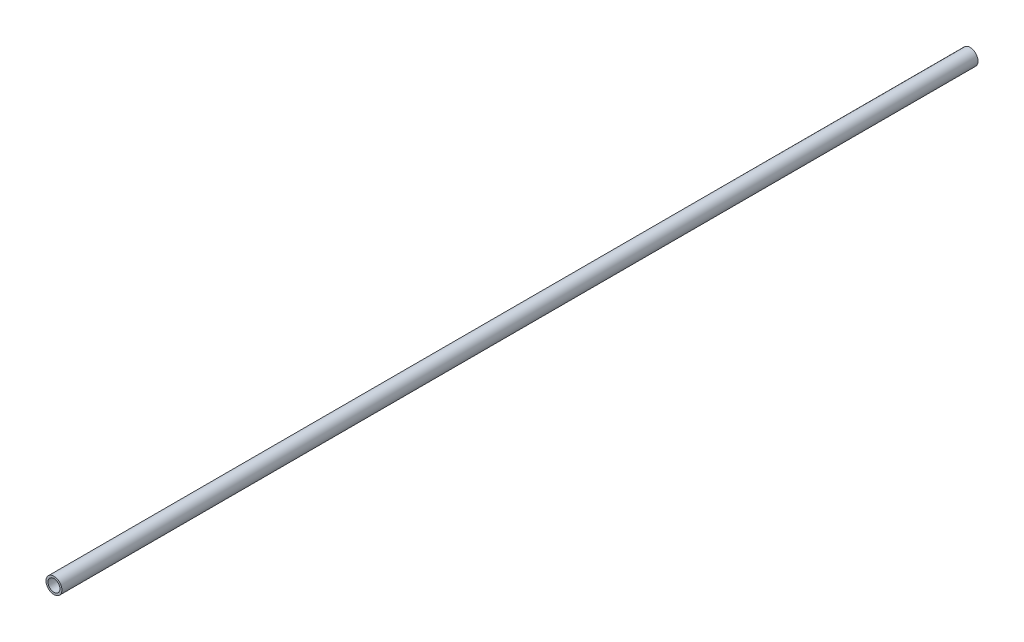
ISO-10303-21;
HEADER;
FILE_DESCRIPTION(('STEP AP214'),'2;1');
FILE_NAME('part.step','',(''),(''),'','','');
FILE_SCHEMA(('AUTOMOTIVE_DESIGN { 1 0 10303 214 1 1 1 1 }'));
ENDSEC;
DATA;
#1=APPLICATION_CONTEXT('core data for automotive mechanical design processes');
#2=APPLICATION_PROTOCOL_DEFINITION('international standard','automotive_design',2000,#1);
#3=PRODUCT_CONTEXT('',#1,'mechanical');
#4=PRODUCT('Part','Part','',(#3));
#5=PRODUCT_RELATED_PRODUCT_CATEGORY('part','',(#4));
#6=PRODUCT_DEFINITION_FORMATION('','',#4);
#7=PRODUCT_DEFINITION_CONTEXT('part definition',#1,'design');
#8=PRODUCT_DEFINITION('design','',#6,#7);
#9=PRODUCT_DEFINITION_SHAPE('','',#8);
#10=(LENGTH_UNIT() NAMED_UNIT(*) SI_UNIT(.MILLI.,.METRE.));
#11=(NAMED_UNIT(*) PLANE_ANGLE_UNIT() SI_UNIT($,.RADIAN.));
#12=(NAMED_UNIT(*) SI_UNIT($,.STERADIAN.) SOLID_ANGLE_UNIT());
#13=UNCERTAINTY_MEASURE_WITH_UNIT(LENGTH_MEASURE(1.E-05),#10,'distance_accuracy_value','');
#14=(GEOMETRIC_REPRESENTATION_CONTEXT(3) GLOBAL_UNCERTAINTY_ASSIGNED_CONTEXT((#13)) GLOBAL_UNIT_ASSIGNED_CONTEXT((#10,
#11,#12)) REPRESENTATION_CONTEXT('',''));
#15=CARTESIAN_POINT('',(0.,0.,0.));
#16=DIRECTION('',(0.,0.,1.));
#17=DIRECTION('',(1.,0.,0.));
#18=AXIS2_PLACEMENT_3D('',#15,#16,#17);
#19=CARTESIAN_POINT('',(0.,0.,460.));
#20=DIRECTION('',(0.,0.,1.));
#21=DIRECTION('',(1.,0.,0.));
#22=AXIS2_PLACEMENT_3D('',#19,#20,#21);
#23=PLANE('',#22);
#24=CARTESIAN_POINT('',(0.,0.,460.));
#25=DIRECTION('',(0.,0.,1.));
#26=DIRECTION('',(1.,0.,0.));
#27=AXIS2_PLACEMENT_3D('',#24,#25,#26);
#28=CIRCLE('',#27,4.);
#29=CARTESIAN_POINT('',(4.,0.,460.));
#30=VERTEX_POINT('',#29);
#31=EDGE_CURVE('E10',#30,#30,#28,.T.);
#32=ORIENTED_EDGE('',*,*,#31,.T.);
#33=EDGE_LOOP('',(#32));
#34=FACE_BOUND('',#33,.T.);
#35=CARTESIAN_POINT('',(0.,0.,460.));
#36=DIRECTION('',(0.,0.,1.));
#37=DIRECTION('',(1.,0.,0.));
#38=AXIS2_PLACEMENT_3D('',#35,#36,#37);
#39=CIRCLE('',#38,3.);
#40=CARTESIAN_POINT('',(3.,0.,460.));
#41=VERTEX_POINT('',#40);
#42=EDGE_CURVE('E44',#41,#41,#39,.T.);
#43=ORIENTED_EDGE('',*,*,#42,.F.);
#44=EDGE_LOOP('',(#43));
#45=FACE_BOUND('',#44,.T.);
#46=ADVANCED_FACE('F33',(#34,#45),#23,.T.);
#47=CARTESIAN_POINT('',(0.,0.,0.));
#48=DIRECTION('',(0.,0.,1.));
#49=DIRECTION('',(1.,0.,0.));
#50=AXIS2_PLACEMENT_3D('',#47,#48,#49);
#51=PLANE('',#50);
#52=CARTESIAN_POINT('',(0.,0.,0.));
#53=DIRECTION('',(0.,0.,1.));
#54=DIRECTION('',(1.,0.,0.));
#55=AXIS2_PLACEMENT_3D('',#52,#53,#54);
#56=CIRCLE('',#55,4.);
#57=CARTESIAN_POINT('',(4.,0.,0.));
#58=VERTEX_POINT('',#57);
#59=EDGE_CURVE('E37',#58,#58,#56,.T.);
#60=ORIENTED_EDGE('',*,*,#59,.F.);
#61=EDGE_LOOP('',(#60));
#62=FACE_BOUND('',#61,.T.);
#63=CARTESIAN_POINT('',(0.,0.,0.));
#64=DIRECTION('',(0.,0.,1.));
#65=DIRECTION('',(1.,0.,0.));
#66=AXIS2_PLACEMENT_3D('',#63,#64,#65);
#67=CIRCLE('',#66,3.);
#68=CARTESIAN_POINT('',(3.,0.,0.));
#69=VERTEX_POINT('',#68);
#70=EDGE_CURVE('E46',#69,#69,#67,.T.);
#71=ORIENTED_EDGE('',*,*,#70,.T.);
#72=EDGE_LOOP('',(#71));
#73=FACE_BOUND('',#72,.T.);
#74=ADVANCED_FACE('F56',(#62,#73),#51,.F.);
#75=CARTESIAN_POINT('',(0.,0.,460.));
#76=DIRECTION('',(0.,0.,-1.));
#77=DIRECTION('',(-1.,0.,0.));
#78=AXIS2_PLACEMENT_3D('',#75,#76,#77);
#79=CYLINDRICAL_SURFACE('',#78,4.);
#80=ORIENTED_EDGE('',*,*,#31,.F.);
#81=EDGE_LOOP('',(#80));
#82=FACE_BOUND('',#81,.T.);
#83=ORIENTED_EDGE('',*,*,#59,.T.);
#84=EDGE_LOOP('',(#83));
#85=FACE_BOUND('',#84,.T.);
#86=ADVANCED_FACE('F35',(#82,#85),#79,.T.);
#87=CARTESIAN_POINT('',(0.,0.,460.));
#88=DIRECTION('',(0.,0.,-1.));
#89=DIRECTION('',(-1.,0.,0.));
#90=AXIS2_PLACEMENT_3D('',#87,#88,#89);
#91=CYLINDRICAL_SURFACE('',#90,3.);
#92=ORIENTED_EDGE('',*,*,#42,.T.);
#93=EDGE_LOOP('',(#92));
#94=FACE_BOUND('',#93,.T.);
#95=ORIENTED_EDGE('',*,*,#70,.F.);
#96=EDGE_LOOP('',(#95));
#97=FACE_BOUND('',#96,.T.);
#98=ADVANCED_FACE('F52',(#94,#97),#91,.F.);
#99=CLOSED_SHELL('',(#46,#74,#86,#98));
#100=MANIFOLD_SOLID_BREP('B2',#99);
#101=ADVANCED_BREP_SHAPE_REPRESENTATION('',(#18,#100),#14);
#102=SHAPE_DEFINITION_REPRESENTATION(#9,#101);
ENDSEC;
END-ISO-10303-21;
